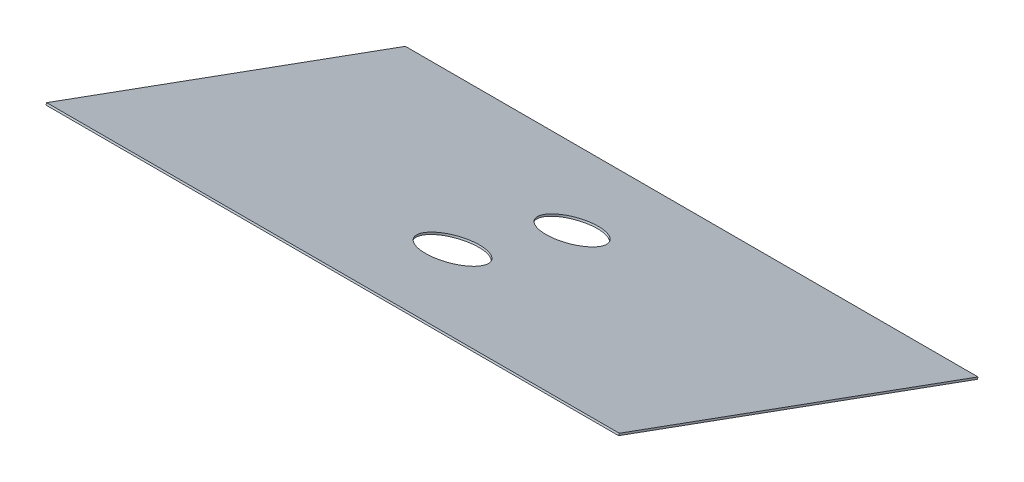
ISO-10303-21;
HEADER;
FILE_DESCRIPTION(('STEP AP214'),'2;1');
FILE_NAME('part.step','',(''),(''),'','','');
FILE_SCHEMA(('AUTOMOTIVE_DESIGN { 1 0 10303 214 1 1 1 1 }'));
ENDSEC;
DATA;
#1=APPLICATION_CONTEXT('core data for automotive mechanical design processes');
#2=APPLICATION_PROTOCOL_DEFINITION('international standard','automotive_design',2000,#1);
#3=PRODUCT_CONTEXT('',#1,'mechanical');
#4=PRODUCT('Part','Part','',(#3));
#5=PRODUCT_RELATED_PRODUCT_CATEGORY('part','',(#4));
#6=PRODUCT_DEFINITION_FORMATION('','',#4);
#7=PRODUCT_DEFINITION_CONTEXT('part definition',#1,'design');
#8=PRODUCT_DEFINITION('design','',#6,#7);
#9=PRODUCT_DEFINITION_SHAPE('','',#8);
#10=(LENGTH_UNIT() NAMED_UNIT(*) SI_UNIT(.MILLI.,.METRE.));
#11=(NAMED_UNIT(*) PLANE_ANGLE_UNIT() SI_UNIT($,.RADIAN.));
#12=(NAMED_UNIT(*) SI_UNIT($,.STERADIAN.) SOLID_ANGLE_UNIT());
#13=UNCERTAINTY_MEASURE_WITH_UNIT(LENGTH_MEASURE(1.E-05),#10,'distance_accuracy_value','');
#14=(GEOMETRIC_REPRESENTATION_CONTEXT(3) GLOBAL_UNCERTAINTY_ASSIGNED_CONTEXT((#13)) GLOBAL_UNIT_ASSIGNED_CONTEXT((#10,
#11,#12)) REPRESENTATION_CONTEXT('',''));
#15=CARTESIAN_POINT('',(0.,0.,0.));
#16=DIRECTION('',(0.,0.,1.));
#17=DIRECTION('',(1.,0.,0.));
#18=AXIS2_PLACEMENT_3D('',#15,#16,#17);
#19=CARTESIAN_POINT('',(0.,-22.480622248936,-10.6695504931436));
#20=DIRECTION('',(-1.,0.,0.));
#21=DIRECTION('',(0.,-0.342020143325666,-0.93969262078591));
#22=AXIS2_PLACEMENT_3D('',#19,#20,#21);
#23=PLANE('',#22);
#24=DIRECTION('',(0.,-0.939692620785909,0.342020143325666));
#25=VECTOR('',#24,1.);
#26=CARTESIAN_POINT('',(0.,-22.480622248936,-10.6695504931436));
#27=LINE('',#26,#25);
#28=CARTESIAN_POINT('',(0.,-22.3866529868574,-10.7037525074761));
#29=VERTEX_POINT('',#28);
#30=CARTESIAN_POINT('',(0.,-22.480622248936,-10.6695504931436));
#31=VERTEX_POINT('',#30);
#32=EDGE_CURVE('E11',#29,#31,#27,.T.);
#33=ORIENTED_EDGE('',*,*,#32,.F.);
#34=DIRECTION('',(0.,-0.342020143325666,-0.93969262078591));
#35=VECTOR('',#34,1.);
#36=CARTESIAN_POINT('',(0.,-22.3866529868574,-10.7037525074761));
#37=LINE('',#36,#35);
#38=CARTESIAN_POINT('',(0.,-29.2270558533707,-29.4976049231943));
#39=VERTEX_POINT('',#38);
#40=EDGE_CURVE('E81',#29,#39,#37,.T.);
#41=ORIENTED_EDGE('',*,*,#40,.T.);
#42=DIRECTION('',(0.,-0.939692620785909,0.342020143325666));
#43=VECTOR('',#42,1.);
#44=CARTESIAN_POINT('',(0.,-29.3210251154493,-29.4634029088618));
#45=LINE('',#44,#43);
#46=CARTESIAN_POINT('',(0.,-29.3210251154493,-29.4634029088618));
#47=VERTEX_POINT('',#46);
#48=EDGE_CURVE('E43',#39,#47,#45,.T.);
#49=ORIENTED_EDGE('',*,*,#48,.T.);
#50=DIRECTION('',(0.,-0.342020143325666,-0.93969262078591));
#51=VECTOR('',#50,1.);
#52=CARTESIAN_POINT('',(0.,-22.480622248936,-10.6695504931436));
#53=LINE('',#52,#51);
#54=EDGE_CURVE('E80',#31,#47,#53,.T.);
#55=ORIENTED_EDGE('',*,*,#54,.F.);
#56=EDGE_LOOP('',(#33,#41,#49,#55));
#57=FACE_BOUND('',#56,.T.);
#58=ADVANCED_FACE('F33',(#57),#23,.T.);
#59=CARTESIAN_POINT('',(0.,-29.3210251154493,-29.4634029088618));
#60=DIRECTION('',(0.,-0.342020143325666,-0.93969262078591));
#61=DIRECTION('',(1.,0.,0.));
#62=AXIS2_PLACEMENT_3D('',#59,#60,#61);
#63=PLANE('',#62);
#64=ORIENTED_EDGE('',*,*,#48,.F.);
#65=DIRECTION('',(1.,0.,0.));
#66=VECTOR('',#65,1.);
#67=CARTESIAN_POINT('',(0.,-29.2270558533707,-29.4976049231943));
#68=LINE('',#67,#66);
#69=CARTESIAN_POINT('',(30.,-29.2270558533707,-29.4976049231943));
#70=VERTEX_POINT('',#69);
#71=EDGE_CURVE('E102',#39,#70,#68,.T.);
#72=ORIENTED_EDGE('',*,*,#71,.T.);
#73=DIRECTION('',(0.,-0.939692620785909,0.342020143325666));
#74=VECTOR('',#73,1.);
#75=CARTESIAN_POINT('',(30.,-29.3210251154493,-29.4634029088618));
#76=LINE('',#75,#74);
#77=CARTESIAN_POINT('',(30.,-29.3210251154493,-29.4634029088618));
#78=VERTEX_POINT('',#77);
#79=EDGE_CURVE('E76',#70,#78,#76,.T.);
#80=ORIENTED_EDGE('',*,*,#79,.T.);
#81=DIRECTION('',(1.,0.,0.));
#82=VECTOR('',#81,1.);
#83=CARTESIAN_POINT('',(0.,-29.3210251154493,-29.4634029088618));
#84=LINE('',#83,#82);
#85=EDGE_CURVE('E88',#47,#78,#84,.T.);
#86=ORIENTED_EDGE('',*,*,#85,.F.);
#87=EDGE_LOOP('',(#64,#72,#80,#86));
#88=FACE_BOUND('',#87,.T.);
#89=ADVANCED_FACE('F91',(#88),#63,.T.);
#90=CARTESIAN_POINT('',(30.,-22.480622248936,-10.6695504931436));
#91=DIRECTION('',(-1.,0.,0.));
#92=DIRECTION('',(0.,-0.342020143325666,-0.93969262078591));
#93=AXIS2_PLACEMENT_3D('',#90,#91,#92);
#94=PLANE('',#93);
#95=ORIENTED_EDGE('',*,*,#79,.F.);
#96=DIRECTION('',(0.,-0.342020143325666,-0.93969262078591));
#97=VECTOR('',#96,1.);
#98=CARTESIAN_POINT('',(30.,-22.3866529868574,-10.7037525074761));
#99=LINE('',#98,#97);
#100=CARTESIAN_POINT('',(30.,-22.3866529868574,-10.7037525074761));
#101=VERTEX_POINT('',#100);
#102=EDGE_CURVE('E92',#101,#70,#99,.T.);
#103=ORIENTED_EDGE('',*,*,#102,.F.);
#104=DIRECTION('',(0.,-0.939692620785909,0.342020143325666));
#105=VECTOR('',#104,1.);
#106=CARTESIAN_POINT('',(30.,-22.480622248936,-10.6695504931436));
#107=LINE('',#106,#105);
#108=CARTESIAN_POINT('',(30.,-22.480622248936,-10.6695504931436));
#109=VERTEX_POINT('',#108);
#110=EDGE_CURVE('E37',#101,#109,#107,.T.);
#111=ORIENTED_EDGE('',*,*,#110,.T.);
#112=DIRECTION('',(0.,-0.342020143325666,-0.93969262078591));
#113=VECTOR('',#112,1.);
#114=CARTESIAN_POINT('',(30.,-22.480622248936,-10.6695504931436));
#115=LINE('',#114,#113);
#116=EDGE_CURVE('E98',#109,#78,#115,.T.);
#117=ORIENTED_EDGE('',*,*,#116,.T.);
#118=EDGE_LOOP('',(#95,#103,#111,#117));
#119=FACE_BOUND('',#118,.T.);
#120=ADVANCED_FACE('F107',(#119),#94,.F.);
#121=CARTESIAN_POINT('',(0.,-22.480622248936,-10.6695504931436));
#122=DIRECTION('',(0.,-0.342020143325666,-0.93969262078591));
#123=DIRECTION('',(1.,0.,0.));
#124=AXIS2_PLACEMENT_3D('',#121,#122,#123);
#125=PLANE('',#124);
#126=DIRECTION('',(1.,0.,0.));
#127=VECTOR('',#126,1.);
#128=CARTESIAN_POINT('',(0.,-22.3866529868574,-10.7037525074761));
#129=LINE('',#128,#127);
#130=EDGE_CURVE('E95',#29,#101,#129,.T.);
#131=ORIENTED_EDGE('',*,*,#130,.F.);
#132=ORIENTED_EDGE('',*,*,#32,.T.);
#133=DIRECTION('',(1.,0.,0.));
#134=VECTOR('',#133,1.);
#135=CARTESIAN_POINT('',(0.,-22.480622248936,-10.6695504931436));
#136=LINE('',#135,#134);
#137=EDGE_CURVE('E89',#31,#109,#136,.T.);
#138=ORIENTED_EDGE('',*,*,#137,.T.);
#139=ORIENTED_EDGE('',*,*,#110,.F.);
#140=EDGE_LOOP('',(#131,#132,#138,#139));
#141=FACE_BOUND('',#140,.T.);
#142=ADVANCED_FACE('F35',(#141),#125,.F.);
#143=CARTESIAN_POINT('',(0.,-22.480622248936,-10.6695504931436));
#144=DIRECTION('',(0.,-0.939692620785909,0.342020143325666));
#145=DIRECTION('',(0.,-0.342020143325666,-0.93969262078591));
#146=AXIS2_PLACEMENT_3D('',#143,#144,#145);
#147=PLANE('',#146);
#148=CARTESIAN_POINT('',(15.,-24.7607565377738,-16.9341679650496));
#149=DIRECTION('',(0.,-0.939692620785909,0.342020143325666));
#150=DIRECTION('',(0.,-0.342020143325666,-0.93969262078591));
#151=AXIS2_PLACEMENT_3D('',#148,#149,#150);
#152=CIRCLE('',#151,1.50543870080356);
#153=CARTESIAN_POINT('',(15.,-24.2458661775569,-15.519518326859));
#154=VERTEX_POINT('',#153);
#155=EDGE_CURVE('E139',#154,#154,#152,.F.);
#156=ORIENTED_EDGE('',*,*,#155,.T.);
#157=EDGE_LOOP('',(#156));
#158=FACE_BOUND('',#157,.T.);
#159=CARTESIAN_POINT('',(15.,-27.0408908266115,-23.1987854369557));
#160=DIRECTION('',(0.,-0.939692620785909,0.342020143325666));
#161=DIRECTION('',(0.,-0.342020143325666,-0.93969262078591));
#162=AXIS2_PLACEMENT_3D('',#159,#160,#161);
#163=CIRCLE('',#162,1.45513450768015);
#164=CARTESIAN_POINT('',(15.,-26.5432055137367,-21.8314062778377));
#165=VERTEX_POINT('',#164);
#166=EDGE_CURVE('E147',#165,#165,#163,.F.);
#167=ORIENTED_EDGE('',*,*,#166,.T.);
#168=EDGE_LOOP('',(#167));
#169=FACE_BOUND('',#168,.T.);
#170=ORIENTED_EDGE('',*,*,#116,.F.);
#171=ORIENTED_EDGE('',*,*,#137,.F.);
#172=ORIENTED_EDGE('',*,*,#54,.T.);
#173=ORIENTED_EDGE('',*,*,#85,.T.);
#174=EDGE_LOOP('',(#170,#171,#172,#173));
#175=FACE_BOUND('',#174,.T.);
#176=ADVANCED_FACE('F87',(#158,#169,#175),#147,.T.);
#177=CARTESIAN_POINT('',(0.,-22.3866529868574,-10.7037525074761));
#178=DIRECTION('',(0.,-0.939692620785909,0.342020143325666));
#179=DIRECTION('',(0.,-0.342020143325666,-0.93969262078591));
#180=AXIS2_PLACEMENT_3D('',#177,#178,#179);
#181=PLANE('',#180);
#182=CARTESIAN_POINT('',(15.,-24.6667872756952,-16.9683699793822));
#183=DIRECTION('',(0.,0.939692620785909,-0.342020143325666));
#184=DIRECTION('',(0.,0.342020143325666,0.939692620785909));
#185=AXIS2_PLACEMENT_3D('',#182,#183,#184);
#186=CIRCLE('',#185,1.50543870080356);
#187=CARTESIAN_POINT('',(15.,-24.1518969154783,-15.5537203411916));
#188=VERTEX_POINT('',#187);
#189=EDGE_CURVE('E104',#188,#188,#186,.T.);
#190=ORIENTED_EDGE('',*,*,#189,.F.);
#191=EDGE_LOOP('',(#190));
#192=FACE_BOUND('',#191,.T.);
#193=CARTESIAN_POINT('',(15.,-26.9469215645329,-23.2329874512883));
#194=DIRECTION('',(0.,0.939692620785909,-0.342020143325666));
#195=DIRECTION('',(0.,0.342020143325666,0.939692620785909));
#196=AXIS2_PLACEMENT_3D('',#193,#194,#195);
#197=CIRCLE('',#196,1.45513450768015);
#198=CARTESIAN_POINT('',(15.,-26.4492362516581,-21.8656082921703));
#199=VERTEX_POINT('',#198);
#200=EDGE_CURVE('E143',#199,#199,#197,.T.);
#201=ORIENTED_EDGE('',*,*,#200,.F.);
#202=EDGE_LOOP('',(#201));
#203=FACE_BOUND('',#202,.T.);
#204=ORIENTED_EDGE('',*,*,#102,.T.);
#205=ORIENTED_EDGE('',*,*,#71,.F.);
#206=ORIENTED_EDGE('',*,*,#40,.F.);
#207=ORIENTED_EDGE('',*,*,#130,.T.);
#208=EDGE_LOOP('',(#204,#205,#206,#207));
#209=FACE_BOUND('',#208,.T.);
#210=ADVANCED_FACE('F109',(#192,#203,#209),#181,.F.);
#211=CARTESIAN_POINT('',(15.,-60.3840199891105,-11.0628789045128));
#212=DIRECTION('',(0.,0.939692620785909,-0.342020143325666));
#213=DIRECTION('',(0.,0.342020143325666,0.939692620785909));
#214=AXIS2_PLACEMENT_3D('',#211,#212,#213);
#215=CYLINDRICAL_SURFACE('',#214,1.45513450768015);
#216=CARTESIAN_POINT('',(15.,-26.5432055137367,-21.8314062778377));
#217=CARTESIAN_POINT('',(15.,-26.5422266672567,-21.8317625488204));
#218=CARTESIAN_POINT('',(15.,-26.5412478207767,-21.832118819803));
#219=CARTESIAN_POINT('',(15.,-26.5392901278167,-21.8328313617682));
#220=CARTESIAN_POINT('',(15.,-26.5383112813367,-21.8331876327509));
#221=CARTESIAN_POINT('',(15.,-26.5363535883768,-21.8339001747161));
#222=CARTESIAN_POINT('',(15.,-26.5353747418968,-21.8342564456988));
#223=CARTESIAN_POINT('',(15.,-26.5334170489368,-21.834968987664));
#224=CARTESIAN_POINT('',(15.,-26.5324382024568,-21.8353252586467));
#225=CARTESIAN_POINT('',(15.,-26.5304805094968,-21.8360378006119));
#226=CARTESIAN_POINT('',(15.,-26.5295016630169,-21.8363940715946));
#227=CARTESIAN_POINT('',(15.,-26.5275439700569,-21.8371066135598));
#228=CARTESIAN_POINT('',(15.,-26.5265651235769,-21.8374628845425));
#229=CARTESIAN_POINT('',(15.,-26.5246074306169,-21.8381754265077));
#230=CARTESIAN_POINT('',(15.,-26.523628584137,-21.8385316974903));
#231=CARTESIAN_POINT('',(15.,-26.521670891177,-21.8392442394556));
#232=CARTESIAN_POINT('',(15.,-26.520692044697,-21.8396005104382));
#233=CARTESIAN_POINT('',(15.,-26.518734351737,-21.8403130524035));
#234=CARTESIAN_POINT('',(15.,-26.517755505257,-21.8406693233861));
#235=CARTESIAN_POINT('',(15.,-26.5157978122971,-21.8413818653514));
#236=CARTESIAN_POINT('',(15.,-26.5148189658171,-21.841738136334));
#237=CARTESIAN_POINT('',(15.,-26.5128612728571,-21.8424506782993));
#238=CARTESIAN_POINT('',(15.,-26.5118824263771,-21.8428069492819));
#239=CARTESIAN_POINT('',(15.,-26.5099247334172,-21.8435194912472));
#240=CARTESIAN_POINT('',(15.,-26.5089458869372,-21.8438757622298));
#241=CARTESIAN_POINT('',(15.,-26.5069881939772,-21.8445883041951));
#242=CARTESIAN_POINT('',(15.,-26.5060093474972,-21.8449445751777));
#243=CARTESIAN_POINT('',(15.,-26.5040516545372,-21.845657117143));
#244=CARTESIAN_POINT('',(15.,-26.5030728080573,-21.8460133881256));
#245=CARTESIAN_POINT('',(15.,-26.5011151150973,-21.8467259300909));
#246=CARTESIAN_POINT('',(15.,-26.5001362686173,-21.8470822010735));
#247=CARTESIAN_POINT('',(15.,-26.4981785756573,-21.8477947430387));
#248=CARTESIAN_POINT('',(15.,-26.4971997291773,-21.8481510140214));
#249=CARTESIAN_POINT('',(15.,-26.4952420362174,-21.8488635559866));
#250=CARTESIAN_POINT('',(15.,-26.4942631897374,-21.8492198269693));
#251=CARTESIAN_POINT('',(15.,-26.4923054967774,-21.8499323689345));
#252=CARTESIAN_POINT('',(15.,-26.4913266502974,-21.8502886399172));
#253=CARTESIAN_POINT('',(15.,-26.4893689573375,-21.8510011818824));
#254=CARTESIAN_POINT('',(15.,-26.4883901108575,-21.8513574528651));
#255=CARTESIAN_POINT('',(15.,-26.4864324178975,-21.8520699948303));
#256=CARTESIAN_POINT('',(15.,-26.4854535714175,-21.852426265813));
#257=CARTESIAN_POINT('',(15.,-26.4834958784575,-21.8531388077782));
#258=CARTESIAN_POINT('',(15.,-26.4825170319776,-21.8534950787608));
#259=CARTESIAN_POINT('',(15.,-26.4805593390176,-21.8542076207261));
#260=CARTESIAN_POINT('',(15.,-26.4795804925376,-21.8545638917087));
#261=CARTESIAN_POINT('',(15.,-26.4776227995776,-21.855276433674));
#262=CARTESIAN_POINT('',(15.,-26.4766439530977,-21.8556327046566));
#263=CARTESIAN_POINT('',(15.,-26.4746862601377,-21.8563452466219));
#264=CARTESIAN_POINT('',(15.,-26.4737074136577,-21.8567015176045));
#265=CARTESIAN_POINT('',(15.,-26.4717497206977,-21.8574140595698));
#266=CARTESIAN_POINT('',(15.,-26.4707708742177,-21.8577703305524));
#267=CARTESIAN_POINT('',(15.,-26.4688131812578,-21.8584828725177));
#268=CARTESIAN_POINT('',(15.,-26.4678343347778,-21.8588391435003));
#269=CARTESIAN_POINT('',(15.,-26.4658766418178,-21.8595516854656));
#270=CARTESIAN_POINT('',(15.,-26.4648977953378,-21.8599079564482));
#271=CARTESIAN_POINT('',(15.,-26.4629401023779,-21.8606204984135));
#272=CARTESIAN_POINT('',(15.,-26.4619612558979,-21.8609767693961));
#273=CARTESIAN_POINT('',(15.,-26.4600035629379,-21.8616893113614));
#274=CARTESIAN_POINT('',(15.,-26.4590247164579,-21.862045582344));
#275=CARTESIAN_POINT('',(15.,-26.4570670234979,-21.8627581243092));
#276=CARTESIAN_POINT('',(15.,-26.456088177018,-21.8631143952919));
#277=CARTESIAN_POINT('',(15.,-26.454130484058,-21.8638269372571));
#278=CARTESIAN_POINT('',(15.,-26.453151637578,-21.8641832082398));
#279=CARTESIAN_POINT('',(15.,-26.451193944618,-21.864895750205));
#280=CARTESIAN_POINT('',(15.,-26.450215098138,-21.8652520211877));
#281=CARTESIAN_POINT('',(15.,-26.4492362516581,-21.8656082921703));
#282=B_SPLINE_CURVE_WITH_KNOTS('',3,(#216,#217,#218,#219,#220,#221,#222,#223,#224,#225,#226,
#227,#228,#229,#230,#231,#232,#233,#234,#235,#236,#237,#238,#239,#240,#241,#242,#243,#244,#245,
#246,#247,#248,#249,#250,#251,#252,#253,#254,#255,#256,#257,#258,#259,#260,#261,#262,#263,#264,
#265,#266,#267,#268,#269,#270,#271,#272,#273,#274,#275,#276,#277,#278,#279,#280,#281),
.UNSPECIFIED.,.F.,.F.,(4,2,2,2,2,2,2,2,2,2,2,2,2,2,2,2,2,2,2,2,2,2,2,2,2,2,2,2,2,2,2,2,4),(0.,
0.00312499999999614,0.00625000000000116,0.0093749999999973,0.0125000000000011,
0.0156249999999985,0.0187499999999958,0.0218749999999996,0.0249999999999958,0.0281250000000008,
0.0312500000000046,0.034375000000002,0.0375000000000058,0.0406250000000031,0.0437500000000005,
0.0468750000000043,0.0500000000000004,0.0531249999999989,0.0562500000000016,0.0593750000000001,
0.0625000000000028,0.0656250000000001,0.0687499999999974,0.0718750000000013,0.0750000000000051,
0.0781250000000036,0.0812500000000063,0.0843750000000036,0.0875000000000009,0.0906250000000048,
0.0937500000000021,0.0968750000000059,0.100000000000003),.UNSPECIFIED.);
#283=EDGE_CURVE('BSEAM125',#165,#199,#282,.T.);
#284=ORIENTED_EDGE('',*,*,#166,.F.);
#285=ORIENTED_EDGE('',*,*,#200,.T.);
#286=ORIENTED_EDGE('',*,*,#283,.T.);
#287=ORIENTED_EDGE('',*,*,#283,.F.);
#288=EDGE_LOOP('',(#284,#286,#285,#287));
#289=FACE_BOUND('',#288,.T.);
#290=ADVANCED_FACE('F125',(#289),#215,.F.);
#291=CARTESIAN_POINT('',(15.,-58.1038857002727,-4.79826143260677));
#292=DIRECTION('',(0.,0.939692620785909,-0.342020143325666));
#293=DIRECTION('',(0.,0.342020143325666,0.939692620785909));
#294=AXIS2_PLACEMENT_3D('',#291,#292,#293);
#295=CYLINDRICAL_SURFACE('',#294,1.50543870080356);
#296=CARTESIAN_POINT('',(15.,-24.2458661775569,-15.519518326859));
#297=CARTESIAN_POINT('',(15.,-24.2448873310769,-15.5198745978416));
#298=CARTESIAN_POINT('',(15.,-24.243908484597,-15.5202308688243));
#299=CARTESIAN_POINT('',(15.,-24.241950791637,-15.5209434107895));
#300=CARTESIAN_POINT('',(15.,-24.240971945157,-15.5212996817722));
#301=CARTESIAN_POINT('',(15.,-24.239014252197,-15.5220122237374));
#302=CARTESIAN_POINT('',(15.,-24.2380354057171,-15.52236849472));
#303=CARTESIAN_POINT('',(15.,-24.2360777127571,-15.5230810366853));
#304=CARTESIAN_POINT('',(15.,-24.2350988662771,-15.5234373076679));
#305=CARTESIAN_POINT('',(15.,-24.2331411733171,-15.5241498496332));
#306=CARTESIAN_POINT('',(15.,-24.2321623268371,-15.5245061206158));
#307=CARTESIAN_POINT('',(15.,-24.2302046338772,-15.5252186625811));
#308=CARTESIAN_POINT('',(15.,-24.2292257873972,-15.5255749335637));
#309=CARTESIAN_POINT('',(15.,-24.2272680944372,-15.526287475529));
#310=CARTESIAN_POINT('',(15.,-24.2262892479572,-15.5266437465116));
#311=CARTESIAN_POINT('',(15.,-24.2243315549973,-15.5273562884769));
#312=CARTESIAN_POINT('',(15.,-24.2233527085173,-15.5277125594595));
#313=CARTESIAN_POINT('',(15.,-24.2213950155573,-15.5284251014248));
#314=CARTESIAN_POINT('',(15.,-24.2204161690773,-15.5287813724074));
#315=CARTESIAN_POINT('',(15.,-24.2184584761173,-15.5294939143727));
#316=CARTESIAN_POINT('',(15.,-24.2174796296374,-15.5298501853553));
#317=CARTESIAN_POINT('',(15.,-24.2155219366774,-15.5305627273206));
#318=CARTESIAN_POINT('',(15.,-24.2145430901974,-15.5309189983032));
#319=CARTESIAN_POINT('',(15.,-24.2125853972374,-15.5316315402685));
#320=CARTESIAN_POINT('',(15.,-24.2116065507574,-15.5319878112511));
#321=CARTESIAN_POINT('',(15.,-24.2096488577975,-15.5327003532163));
#322=CARTESIAN_POINT('',(15.,-24.2086700113175,-15.533056624199));
#323=CARTESIAN_POINT('',(15.,-24.2067123183575,-15.5337691661642));
#324=CARTESIAN_POINT('',(15.,-24.2057334718775,-15.5341254371469));
#325=CARTESIAN_POINT('',(15.,-24.2037757789176,-15.5348379791121));
#326=CARTESIAN_POINT('',(15.,-24.2027969324376,-15.5351942500948));
#327=CARTESIAN_POINT('',(15.,-24.2008392394776,-15.53590679206));
#328=CARTESIAN_POINT('',(15.,-24.1998603929976,-15.5362630630427));
#329=CARTESIAN_POINT('',(15.,-24.1979027000376,-15.5369756050079));
#330=CARTESIAN_POINT('',(15.,-24.1969238535577,-15.5373318759905));
#331=CARTESIAN_POINT('',(15.,-24.1949661605977,-15.5380444179558));
#332=CARTESIAN_POINT('',(15.,-24.1939873141177,-15.5384006889384));
#333=CARTESIAN_POINT('',(15.,-24.1920296211577,-15.5391132309037));
#334=CARTESIAN_POINT('',(15.,-24.1910507746778,-15.5394695018863));
#335=CARTESIAN_POINT('',(15.,-24.1890930817178,-15.5401820438516));
#336=CARTESIAN_POINT('',(15.,-24.1881142352378,-15.5405383148342));
#337=CARTESIAN_POINT('',(15.,-24.1861565422778,-15.5412508567995));
#338=CARTESIAN_POINT('',(15.,-24.1851776957978,-15.5416071277821));
#339=CARTESIAN_POINT('',(15.,-24.1832200028379,-15.5423196697474));
#340=CARTESIAN_POINT('',(15.,-24.1822411563579,-15.54267594073));
#341=CARTESIAN_POINT('',(15.,-24.1802834633979,-15.5433884826953));
#342=CARTESIAN_POINT('',(15.,-24.1793046169179,-15.5437447536779));
#343=CARTESIAN_POINT('',(15.,-24.177346923958,-15.5444572956432));
#344=CARTESIAN_POINT('',(15.,-24.176368077478,-15.5448135666258));
#345=CARTESIAN_POINT('',(15.,-24.174410384518,-15.5455261085911));
#346=CARTESIAN_POINT('',(15.,-24.173431538038,-15.5458823795737));
#347=CARTESIAN_POINT('',(15.,-24.171473845078,-15.546594921539));
#348=CARTESIAN_POINT('',(15.,-24.1704949985981,-15.5469511925216));
#349=CARTESIAN_POINT('',(15.,-24.1685373056381,-15.5476637344868));
#350=CARTESIAN_POINT('',(15.,-24.1675584591581,-15.5480200054695));
#351=CARTESIAN_POINT('',(15.,-24.1656007661981,-15.5487325474347));
#352=CARTESIAN_POINT('',(15.,-24.1646219197182,-15.5490888184174));
#353=CARTESIAN_POINT('',(15.,-24.1626642267582,-15.5498013603826));
#354=CARTESIAN_POINT('',(15.,-24.1616853802782,-15.5501576313653));
#355=CARTESIAN_POINT('',(15.,-24.1597276873182,-15.5508701733305));
#356=CARTESIAN_POINT('',(15.,-24.1587488408382,-15.5512264443132));
#357=CARTESIAN_POINT('',(15.,-24.1567911478783,-15.5519389862784));
#358=CARTESIAN_POINT('',(15.,-24.1558123013983,-15.552295257261));
#359=CARTESIAN_POINT('',(15.,-24.1538546084383,-15.5530077992263));
#360=CARTESIAN_POINT('',(15.,-24.1528757619583,-15.5533640702089));
#361=CARTESIAN_POINT('',(15.,-24.1518969154783,-15.5537203411916));
#362=B_SPLINE_CURVE_WITH_KNOTS('',3,(#296,#297,#298,#299,#300,#301,#302,#303,#304,#305,#306,
#307,#308,#309,#310,#311,#312,#313,#314,#315,#316,#317,#318,#319,#320,#321,#322,#323,#324,#325,
#326,#327,#328,#329,#330,#331,#332,#333,#334,#335,#336,#337,#338,#339,#340,#341,#342,#343,#344,
#345,#346,#347,#348,#349,#350,#351,#352,#353,#354,#355,#356,#357,#358,#359,#360,#361),
.UNSPECIFIED.,.F.,.F.,(4,2,2,2,2,2,2,2,2,2,2,2,2,2,2,2,2,2,2,2,2,2,2,2,2,2,2,2,2,2,2,2,4),(0.,
0.00312499999999732,0.00625000000000116,0.00937499999999789,0.0125000000000017,
0.0156249999999991,0.0187499999999964,0.0218750000000002,0.024999999999997,0.028125000000002,
0.0312500000000052,0.0343750000000026,0.0375000000000064,0.0406250000000037,0.0437500000000011,
0.0468750000000043,0.0500000000000016,0.0531249999999989,0.0562500000000028,0.0593750000000001,
0.0625000000000034,0.0656250000000007,0.068749999999998,0.0718750000000019,0.0750000000000063,
0.0781250000000036,0.0812500000000075,0.0843750000000042,0.0875000000000015,0.0906250000000054,
0.0937500000000027,0.0968750000000065,0.100000000000003),.UNSPECIFIED.);
#363=EDGE_CURVE('BSEAM130',#154,#188,#362,.T.);
#364=ORIENTED_EDGE('',*,*,#155,.F.);
#365=ORIENTED_EDGE('',*,*,#189,.T.);
#366=ORIENTED_EDGE('',*,*,#363,.T.);
#367=ORIENTED_EDGE('',*,*,#363,.F.);
#368=EDGE_LOOP('',(#364,#366,#365,#367));
#369=FACE_BOUND('',#368,.T.);
#370=ADVANCED_FACE('F130',(#369),#295,.F.);
#371=CLOSED_SHELL('',(#58,#89,#120,#142,#176,#210,#290,#370));
#372=MANIFOLD_SOLID_BREP('B2',#371);
#373=ADVANCED_BREP_SHAPE_REPRESENTATION('',(#18,#372),#14);
#374=SHAPE_DEFINITION_REPRESENTATION(#9,#373);
ENDSEC;
END-ISO-10303-21;
